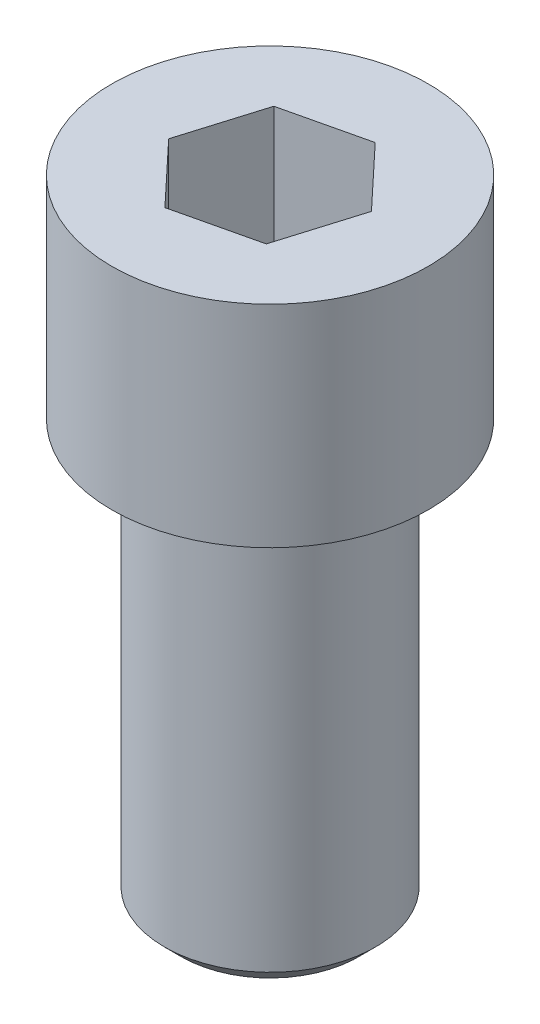
ISO-10303-21;
HEADER;
FILE_DESCRIPTION(('STEP AP214'),'2;1');
FILE_NAME('part.step','',(''),(''),'','','');
FILE_SCHEMA(('AUTOMOTIVE_DESIGN { 1 0 10303 214 1 1 1 1 }'));
ENDSEC;
DATA;
#1=APPLICATION_CONTEXT('core data for automotive mechanical design processes');
#2=APPLICATION_PROTOCOL_DEFINITION('international standard','automotive_design',2000,#1);
#3=PRODUCT_CONTEXT('',#1,'mechanical');
#4=PRODUCT('Part','Part','',(#3));
#5=PRODUCT_RELATED_PRODUCT_CATEGORY('part','',(#4));
#6=PRODUCT_DEFINITION_FORMATION('','',#4);
#7=PRODUCT_DEFINITION_CONTEXT('part definition',#1,'design');
#8=PRODUCT_DEFINITION('design','',#6,#7);
#9=PRODUCT_DEFINITION_SHAPE('','',#8);
#10=(LENGTH_UNIT() NAMED_UNIT(*) SI_UNIT(.MILLI.,.METRE.));
#11=(NAMED_UNIT(*) PLANE_ANGLE_UNIT() SI_UNIT($,.RADIAN.));
#12=(NAMED_UNIT(*) SI_UNIT($,.STERADIAN.) SOLID_ANGLE_UNIT());
#13=UNCERTAINTY_MEASURE_WITH_UNIT(LENGTH_MEASURE(1.E-05),#10,'distance_accuracy_value','');
#14=(GEOMETRIC_REPRESENTATION_CONTEXT(3) GLOBAL_UNCERTAINTY_ASSIGNED_CONTEXT((#13)) GLOBAL_UNIT_ASSIGNED_CONTEXT((#10,
#11,#12)) REPRESENTATION_CONTEXT('',''));
#15=CARTESIAN_POINT('',(0.,0.,0.));
#16=DIRECTION('',(0.,0.,1.));
#17=DIRECTION('',(1.,0.,0.));
#18=AXIS2_PLACEMENT_3D('',#15,#16,#17);
#19=CARTESIAN_POINT('',(0.,0.75,0.));
#20=DIRECTION('',(0.,-1.,0.));
#21=DIRECTION('',(0.,0.,-1.));
#22=AXIS2_PLACEMENT_3D('',#19,#20,#21);
#23=CYLINDRICAL_SURFACE('',#22,0.1875);
#24=CARTESIAN_POINT('',(0.,0.5,0.));
#25=DIRECTION('',(0.,1.,0.));
#26=DIRECTION('',(0.,0.,1.));
#27=AXIS2_PLACEMENT_3D('',#24,#25,#26);
#28=CIRCLE('',#27,0.1875);
#29=CARTESIAN_POINT('',(0.,0.5,0.1875));
#30=VERTEX_POINT('',#29);
#31=EDGE_CURVE('E138',#30,#30,#28,.T.);
#32=ORIENTED_EDGE('',*,*,#31,.T.);
#33=EDGE_LOOP('',(#32));
#34=FACE_BOUND('',#33,.T.);
#35=CARTESIAN_POINT('',(0.,0.75,0.));
#36=DIRECTION('',(0.,1.,0.));
#37=DIRECTION('',(0.,0.,1.));
#38=AXIS2_PLACEMENT_3D('',#35,#36,#37);
#39=CIRCLE('',#38,0.1875);
#40=CARTESIAN_POINT('',(0.,0.75,0.1875));
#41=VERTEX_POINT('',#40);
#42=EDGE_CURVE('E157',#41,#41,#39,.T.);
#43=ORIENTED_EDGE('',*,*,#42,.F.);
#44=EDGE_LOOP('',(#43));
#45=FACE_BOUND('',#44,.T.);
#46=ADVANCED_FACE('F41',(#34,#45),#23,.T.);
#47=CARTESIAN_POINT('',(0.,0.75,0.));
#48=DIRECTION('',(0.,1.,0.));
#49=DIRECTION('',(0.,0.,1.));
#50=AXIS2_PLACEMENT_3D('',#47,#48,#49);
#51=PLANE('',#50);
#52=DIRECTION('',(0.973613721894904,0.,-0.228202367511716));
#53=VECTOR('',#52,1.);
#54=CARTESIAN_POINT('',(-0.0289177813478553,0.75,0.0957275400389963));
#55=LINE('',#54,#53);
#56=CARTESIAN_POINT('',(-0.0289177813478553,0.75,0.0957275400389963));
#57=VERTEX_POINT('',#56);
#58=CARTESIAN_POINT('',(0.068443590841635,0.75,0.0729073032878247));
#59=VERTEX_POINT('',#58);
#60=EDGE_CURVE('E57',#57,#59,#55,.T.);
#61=ORIENTED_EDGE('',*,*,#60,.F.);
#62=DIRECTION('',(0.68443590841635,0.,0.729073032878247));
#63=VECTOR('',#62,1.);
#64=CARTESIAN_POINT('',(-0.0973613721894904,0.75,0.0228202367511715));
#65=LINE('',#64,#63);
#66=CARTESIAN_POINT('',(-0.0973613721894904,0.75,0.0228202367511715));
#67=VERTEX_POINT('',#66);
#68=EDGE_CURVE('E151',#67,#57,#65,.T.);
#69=ORIENTED_EDGE('',*,*,#68,.F.);
#70=DIRECTION('',(-0.289177813478554,0.,0.957275400389962));
#71=VECTOR('',#70,1.);
#72=CARTESIAN_POINT('',(-0.068443590841635,0.75,-0.0729073032878247));
#73=LINE('',#72,#71);
#74=CARTESIAN_POINT('',(-0.068443590841635,0.75,-0.0729073032878247));
#75=VERTEX_POINT('',#74);
#76=EDGE_CURVE('E148',#75,#67,#73,.T.);
#77=ORIENTED_EDGE('',*,*,#76,.F.);
#78=DIRECTION('',(-0.973613721894904,0.,0.228202367511716));
#79=VECTOR('',#78,1.);
#80=CARTESIAN_POINT('',(0.0289177813478554,0.75,-0.0957275400389962));
#81=LINE('',#80,#79);
#82=CARTESIAN_POINT('',(0.0289177813478554,0.75,-0.0957275400389962));
#83=VERTEX_POINT('',#82);
#84=EDGE_CURVE('E105',#83,#75,#81,.T.);
#85=ORIENTED_EDGE('',*,*,#84,.F.);
#86=DIRECTION('',(-0.68443590841635,0.,-0.729073032878247));
#87=VECTOR('',#86,1.);
#88=CARTESIAN_POINT('',(0.0973613721894904,0.75,-0.0228202367511715));
#89=LINE('',#88,#87);
#90=CARTESIAN_POINT('',(0.0973613721894904,0.75,-0.0228202367511715));
#91=VERTEX_POINT('',#90);
#92=EDGE_CURVE('E142',#91,#83,#89,.T.);
#93=ORIENTED_EDGE('',*,*,#92,.F.);
#94=DIRECTION('',(0.289177813478554,0.,-0.957275400389962));
#95=VECTOR('',#94,1.);
#96=CARTESIAN_POINT('',(0.068443590841635,0.75,0.0729073032878247));
#97=LINE('',#96,#95);
#98=EDGE_CURVE('E137',#59,#91,#97,.T.);
#99=ORIENTED_EDGE('',*,*,#98,.F.);
#100=EDGE_LOOP('',(#61,#69,#77,#85,#93,#99));
#101=FACE_BOUND('',#100,.T.);
#102=ORIENTED_EDGE('',*,*,#42,.T.);
#103=EDGE_LOOP('',(#102));
#104=FACE_BOUND('',#103,.T.);
#105=ADVANCED_FACE('F194',(#101,#104),#51,.T.);
#106=CARTESIAN_POINT('',(-0.0289177813478553,0.6,0.0957275400389963));
#107=DIRECTION('',(0.228202367511716,0.,0.973613721894904));
#108=DIRECTION('',(0.973613721894904,0.,-0.228202367511716));
#109=AXIS2_PLACEMENT_3D('',#106,#107,#108);
#110=PLANE('',#109);
#111=ORIENTED_EDGE('',*,*,#60,.T.);
#112=DIRECTION('',(0.,1.,0.));
#113=VECTOR('',#112,1.);
#114=CARTESIAN_POINT('',(0.068443590841635,0.6,0.0729073032878247));
#115=LINE('',#114,#113);
#116=CARTESIAN_POINT('',(0.068443590841635,0.6,0.0729073032878247));
#117=VERTEX_POINT('',#116);
#118=EDGE_CURVE('E87',#117,#59,#115,.T.);
#119=ORIENTED_EDGE('',*,*,#118,.F.);
#120=DIRECTION('',(0.973613721894904,0.,-0.228202367511716));
#121=VECTOR('',#120,1.);
#122=CARTESIAN_POINT('',(-0.0289177813478553,0.6,0.0957275400389963));
#123=LINE('',#122,#121);
#124=CARTESIAN_POINT('',(-0.0289177813478553,0.6,0.0957275400389963));
#125=VERTEX_POINT('',#124);
#126=EDGE_CURVE('E154',#125,#117,#123,.T.);
#127=ORIENTED_EDGE('',*,*,#126,.F.);
#128=DIRECTION('',(0.,1.,0.));
#129=VECTOR('',#128,1.);
#130=CARTESIAN_POINT('',(-0.0289177813478553,0.6,0.0957275400389963));
#131=LINE('',#130,#129);
#132=EDGE_CURVE('E65',#125,#57,#131,.T.);
#133=ORIENTED_EDGE('',*,*,#132,.T.);
#134=EDGE_LOOP('',(#111,#119,#127,#133));
#135=FACE_BOUND('',#134,.T.);
#136=ADVANCED_FACE('F200',(#135),#110,.F.);
#137=CARTESIAN_POINT('',(-0.0973613721894904,0.6,0.0228202367511715));
#138=DIRECTION('',(-0.729073032878247,0.,0.68443590841635));
#139=DIRECTION('',(0.68443590841635,0.,0.729073032878247));
#140=AXIS2_PLACEMENT_3D('',#137,#138,#139);
#141=PLANE('',#140);
#142=ORIENTED_EDGE('',*,*,#68,.T.);
#143=ORIENTED_EDGE('',*,*,#132,.F.);
#144=DIRECTION('',(0.68443590841635,0.,0.729073032878247));
#145=VECTOR('',#144,1.);
#146=CARTESIAN_POINT('',(-0.0973613721894904,0.6,0.0228202367511715));
#147=LINE('',#146,#145);
#148=CARTESIAN_POINT('',(-0.0973613721894904,0.6,0.0228202367511715));
#149=VERTEX_POINT('',#148);
#150=EDGE_CURVE('E119',#149,#125,#147,.T.);
#151=ORIENTED_EDGE('',*,*,#150,.F.);
#152=DIRECTION('',(0.,1.,0.));
#153=VECTOR('',#152,1.);
#154=CARTESIAN_POINT('',(-0.0973613721894904,0.6,0.0228202367511715));
#155=LINE('',#154,#153);
#156=EDGE_CURVE('E110',#149,#67,#155,.T.);
#157=ORIENTED_EDGE('',*,*,#156,.T.);
#158=EDGE_LOOP('',(#142,#143,#151,#157));
#159=FACE_BOUND('',#158,.T.);
#160=ADVANCED_FACE('F215',(#159),#141,.F.);
#161=CARTESIAN_POINT('',(-0.068443590841635,0.6,-0.0729073032878247));
#162=DIRECTION('',(-0.957275400389962,0.,-0.289177813478554));
#163=DIRECTION('',(-0.289177813478554,0.,0.957275400389962));
#164=AXIS2_PLACEMENT_3D('',#161,#162,#163);
#165=PLANE('',#164);
#166=ORIENTED_EDGE('',*,*,#76,.T.);
#167=ORIENTED_EDGE('',*,*,#156,.F.);
#168=DIRECTION('',(-0.289177813478554,0.,0.957275400389962));
#169=VECTOR('',#168,1.);
#170=CARTESIAN_POINT('',(-0.068443590841635,0.6,-0.0729073032878247));
#171=LINE('',#170,#169);
#172=CARTESIAN_POINT('',(-0.068443590841635,0.6,-0.0729073032878247));
#173=VERTEX_POINT('',#172);
#174=EDGE_CURVE('E114',#173,#149,#171,.T.);
#175=ORIENTED_EDGE('',*,*,#174,.F.);
#176=DIRECTION('',(0.,1.,0.));
#177=VECTOR('',#176,1.);
#178=CARTESIAN_POINT('',(-0.068443590841635,0.6,-0.0729073032878247));
#179=LINE('',#178,#177);
#180=EDGE_CURVE('E98',#173,#75,#179,.T.);
#181=ORIENTED_EDGE('',*,*,#180,.T.);
#182=EDGE_LOOP('',(#166,#167,#175,#181));
#183=FACE_BOUND('',#182,.T.);
#184=ADVANCED_FACE('F115',(#183),#165,.F.);
#185=CARTESIAN_POINT('',(0.0289177813478554,0.6,-0.0957275400389962));
#186=DIRECTION('',(-0.228202367511715,0.,-0.973613721894904));
#187=DIRECTION('',(-0.973613721894904,0.,0.228202367511715));
#188=AXIS2_PLACEMENT_3D('',#185,#186,#187);
#189=PLANE('',#188);
#190=ORIENTED_EDGE('',*,*,#84,.T.);
#191=ORIENTED_EDGE('',*,*,#180,.F.);
#192=DIRECTION('',(-0.973613721894904,0.,0.228202367511716));
#193=VECTOR('',#192,1.);
#194=CARTESIAN_POINT('',(0.0289177813478554,0.6,-0.0957275400389962));
#195=LINE('',#194,#193);
#196=CARTESIAN_POINT('',(0.0289177813478554,0.6,-0.0957275400389962));
#197=VERTEX_POINT('',#196);
#198=EDGE_CURVE('E102',#197,#173,#195,.T.);
#199=ORIENTED_EDGE('',*,*,#198,.F.);
#200=DIRECTION('',(0.,1.,0.));
#201=VECTOR('',#200,1.);
#202=CARTESIAN_POINT('',(0.0289177813478554,0.6,-0.0957275400389962));
#203=LINE('',#202,#201);
#204=EDGE_CURVE('E111',#197,#83,#203,.T.);
#205=ORIENTED_EDGE('',*,*,#204,.T.);
#206=EDGE_LOOP('',(#190,#191,#199,#205));
#207=FACE_BOUND('',#206,.T.);
#208=ADVANCED_FACE('F100',(#207),#189,.F.);
#209=CARTESIAN_POINT('',(0.0973613721894904,0.6,-0.0228202367511715));
#210=DIRECTION('',(0.729073032878247,0.,-0.68443590841635));
#211=DIRECTION('',(-0.68443590841635,0.,-0.729073032878247));
#212=AXIS2_PLACEMENT_3D('',#209,#210,#211);
#213=PLANE('',#212);
#214=ORIENTED_EDGE('',*,*,#92,.T.);
#215=ORIENTED_EDGE('',*,*,#204,.F.);
#216=DIRECTION('',(-0.68443590841635,0.,-0.729073032878247));
#217=VECTOR('',#216,1.);
#218=CARTESIAN_POINT('',(0.0973613721894904,0.6,-0.0228202367511715));
#219=LINE('',#218,#217);
#220=CARTESIAN_POINT('',(0.0973613721894904,0.6,-0.0228202367511715));
#221=VERTEX_POINT('',#220);
#222=EDGE_CURVE('E125',#221,#197,#219,.T.);
#223=ORIENTED_EDGE('',*,*,#222,.F.);
#224=DIRECTION('',(0.,1.,0.));
#225=VECTOR('',#224,1.);
#226=CARTESIAN_POINT('',(0.0973613721894904,0.6,-0.0228202367511715));
#227=LINE('',#226,#225);
#228=EDGE_CURVE('E162',#221,#91,#227,.T.);
#229=ORIENTED_EDGE('',*,*,#228,.T.);
#230=EDGE_LOOP('',(#214,#215,#223,#229));
#231=FACE_BOUND('',#230,.T.);
#232=ADVANCED_FACE('F219',(#231),#213,.F.);
#233=CARTESIAN_POINT('',(0.068443590841635,0.6,0.0729073032878247));
#234=DIRECTION('',(0.957275400389962,0.,0.289177813478554));
#235=DIRECTION('',(0.289177813478554,0.,-0.957275400389963));
#236=AXIS2_PLACEMENT_3D('',#233,#234,#235);
#237=PLANE('',#236);
#238=ORIENTED_EDGE('',*,*,#98,.T.);
#239=ORIENTED_EDGE('',*,*,#228,.F.);
#240=DIRECTION('',(0.289177813478554,0.,-0.957275400389962));
#241=VECTOR('',#240,1.);
#242=CARTESIAN_POINT('',(0.068443590841635,0.6,0.0729073032878247));
#243=LINE('',#242,#241);
#244=EDGE_CURVE('E129',#117,#221,#243,.T.);
#245=ORIENTED_EDGE('',*,*,#244,.F.);
#246=ORIENTED_EDGE('',*,*,#118,.T.);
#247=EDGE_LOOP('',(#238,#239,#245,#246));
#248=FACE_BOUND('',#247,.T.);
#249=ADVANCED_FACE('F216',(#248),#237,.F.);
#250=CARTESIAN_POINT('',(0.,0.6,0.));
#251=DIRECTION('',(0.,1.,0.));
#252=DIRECTION('',(0.,0.,1.));
#253=AXIS2_PLACEMENT_3D('',#250,#251,#252);
#254=PLANE('',#253);
#255=ORIENTED_EDGE('',*,*,#126,.T.);
#256=ORIENTED_EDGE('',*,*,#244,.T.);
#257=ORIENTED_EDGE('',*,*,#222,.T.);
#258=ORIENTED_EDGE('',*,*,#198,.T.);
#259=ORIENTED_EDGE('',*,*,#174,.T.);
#260=ORIENTED_EDGE('',*,*,#150,.T.);
#261=EDGE_LOOP('',(#255,#256,#257,#258,#259,#260));
#262=FACE_BOUND('',#261,.T.);
#263=ADVANCED_FACE('F122',(#262),#254,.T.);
#264=CARTESIAN_POINT('',(0.,0.5,0.));
#265=DIRECTION('',(0.,1.,0.));
#266=DIRECTION('',(0.,0.,1.));
#267=AXIS2_PLACEMENT_3D('',#264,#265,#266);
#268=PLANE('',#267);
#269=CARTESIAN_POINT('',(0.,0.5,0.));
#270=DIRECTION('',(0.,1.,0.));
#271=DIRECTION('',(0.,0.,1.));
#272=AXIS2_PLACEMENT_3D('',#269,#270,#271);
#273=CIRCLE('',#272,0.14);
#274=CARTESIAN_POINT('',(0.,0.5,0.14));
#275=VERTEX_POINT('',#274);
#276=EDGE_CURVE('E50',#275,#275,#273,.T.);
#277=ORIENTED_EDGE('',*,*,#276,.T.);
#278=EDGE_LOOP('',(#277));
#279=FACE_BOUND('',#278,.T.);
#280=ORIENTED_EDGE('',*,*,#31,.F.);
#281=EDGE_LOOP('',(#280));
#282=FACE_BOUND('',#281,.T.);
#283=ADVANCED_FACE('F181',(#279,#282),#268,.F.);
#284=CARTESIAN_POINT('',(0.,0.5,0.));
#285=DIRECTION('',(0.,-1.,0.));
#286=DIRECTION('',(0.,0.,-1.));
#287=AXIS2_PLACEMENT_3D('',#284,#285,#286);
#288=CYLINDRICAL_SURFACE('',#287,0.125);
#289=CARTESIAN_POINT('',(0.,0.485,0.));
#290=DIRECTION('',(0.,1.,0.));
#291=DIRECTION('',(0.,0.,1.));
#292=AXIS2_PLACEMENT_3D('',#289,#290,#291);
#293=CIRCLE('',#292,0.125);
#294=CARTESIAN_POINT('',(0.,0.485,0.125));
#295=VERTEX_POINT('',#294);
#296=EDGE_CURVE('E11',#295,#295,#293,.F.);
#297=ORIENTED_EDGE('',*,*,#296,.T.);
#298=EDGE_LOOP('',(#297));
#299=FACE_BOUND('',#298,.T.);
#300=CARTESIAN_POINT('',(0.,0.0200000000000002,0.));
#301=DIRECTION('',(0.,1.,0.));
#302=DIRECTION('',(0.,0.,1.));
#303=AXIS2_PLACEMENT_3D('',#300,#301,#302);
#304=CIRCLE('',#303,0.125);
#305=CARTESIAN_POINT('',(0.,0.0200000000000002,0.125));
#306=VERTEX_POINT('',#305);
#307=EDGE_CURVE('E170',#306,#306,#304,.T.);
#308=ORIENTED_EDGE('',*,*,#307,.T.);
#309=EDGE_LOOP('',(#308));
#310=FACE_BOUND('',#309,.T.);
#311=ADVANCED_FACE('F210',(#299,#310),#288,.T.);
#312=CARTESIAN_POINT('',(0.,0.,0.));
#313=DIRECTION('',(0.,1.,0.));
#314=DIRECTION('',(0.,0.,1.));
#315=AXIS2_PLACEMENT_3D('',#312,#313,#314);
#316=PLANE('',#315);
#317=CARTESIAN_POINT('',(0.,0.,0.));
#318=DIRECTION('',(0.,1.,0.));
#319=DIRECTION('',(0.,0.,1.));
#320=AXIS2_PLACEMENT_3D('',#317,#318,#319);
#321=CIRCLE('',#320,0.105);
#322=CARTESIAN_POINT('',(0.,0.,0.105));
#323=VERTEX_POINT('',#322);
#324=EDGE_CURVE('E174',#323,#323,#321,.F.);
#325=ORIENTED_EDGE('',*,*,#324,.T.);
#326=EDGE_LOOP('',(#325));
#327=FACE_BOUND('',#326,.T.);
#328=ADVANCED_FACE('F190',(#327),#316,.F.);
#329=CARTESIAN_POINT('',(0.,0.0200000000000002,0.));
#330=DIRECTION('',(0.,1.,0.));
#331=DIRECTION('',(0.,0.,1.));
#332=AXIS2_PLACEMENT_3D('',#329,#330,#331);
#333=CONICAL_SURFACE('',#332,0.125,0.785398163397451);
#334=ORIENTED_EDGE('',*,*,#324,.F.);
#335=EDGE_LOOP('',(#334));
#336=FACE_BOUND('',#335,.T.);
#337=ORIENTED_EDGE('',*,*,#307,.F.);
#338=EDGE_LOOP('',(#337));
#339=FACE_BOUND('',#338,.T.);
#340=ADVANCED_FACE('F185',(#336,#339),#333,.T.);
#341=CARTESIAN_POINT('',(0.,0.485,0.));
#342=DIRECTION('',(0.,1.,0.));
#343=DIRECTION('',(0.,0.,1.));
#344=AXIS2_PLACEMENT_3D('',#341,#342,#343);
#345=TOROIDAL_SURFACE('',#344,0.14,0.015);
#346=ORIENTED_EDGE('',*,*,#296,.F.);
#347=EDGE_LOOP('',(#346));
#348=FACE_BOUND('',#347,.T.);
#349=ORIENTED_EDGE('',*,*,#276,.F.);
#350=EDGE_LOOP('',(#349));
#351=FACE_BOUND('',#350,.T.);
#352=ADVANCED_FACE('F43',(#348,#351),#345,.F.);
#353=CLOSED_SHELL('',(#46,#105,#136,#160,#184,#208,#232,#249,#263,#283,#311,#328,#340,#352));
#354=MANIFOLD_SOLID_BREP('B2',#353);
#355=ADVANCED_BREP_SHAPE_REPRESENTATION('',(#18,#354),#14);
#356=SHAPE_DEFINITION_REPRESENTATION(#9,#355);
ENDSEC;
END-ISO-10303-21;
